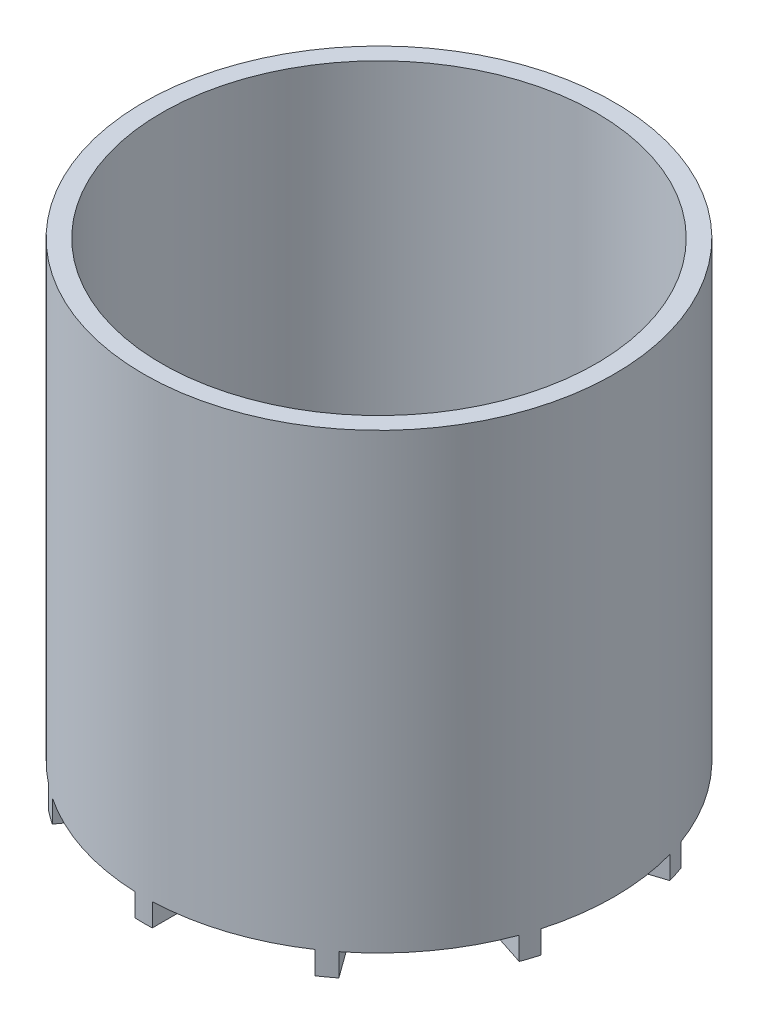
ISO-10303-21;
HEADER;
FILE_DESCRIPTION(('STEP AP214'),'2;1');
FILE_NAME('part.step','',(''),(''),'','','');
FILE_SCHEMA(('AUTOMOTIVE_DESIGN { 1 0 10303 214 1 1 1 1 }'));
ENDSEC;
DATA;
#1=APPLICATION_CONTEXT('core data for automotive mechanical design processes');
#2=APPLICATION_PROTOCOL_DEFINITION('international standard','automotive_design',2000,#1);
#3=PRODUCT_CONTEXT('',#1,'mechanical');
#4=PRODUCT('Part','Part','',(#3));
#5=PRODUCT_RELATED_PRODUCT_CATEGORY('part','',(#4));
#6=PRODUCT_DEFINITION_FORMATION('','',#4);
#7=PRODUCT_DEFINITION_CONTEXT('part definition',#1,'design');
#8=PRODUCT_DEFINITION('design','',#6,#7);
#9=PRODUCT_DEFINITION_SHAPE('','',#8);
#10=(LENGTH_UNIT() NAMED_UNIT(*) SI_UNIT(.MILLI.,.METRE.));
#11=(NAMED_UNIT(*) PLANE_ANGLE_UNIT() SI_UNIT($,.RADIAN.));
#12=(NAMED_UNIT(*) SI_UNIT($,.STERADIAN.) SOLID_ANGLE_UNIT());
#13=UNCERTAINTY_MEASURE_WITH_UNIT(LENGTH_MEASURE(1.E-05),#10,'distance_accuracy_value','');
#14=(GEOMETRIC_REPRESENTATION_CONTEXT(3) GLOBAL_UNCERTAINTY_ASSIGNED_CONTEXT((#13)) GLOBAL_UNIT_ASSIGNED_CONTEXT((#10,
#11,#12)) REPRESENTATION_CONTEXT('',''));
#15=CARTESIAN_POINT('',(0.,0.,0.));
#16=DIRECTION('',(0.,0.,1.));
#17=DIRECTION('',(1.,0.,0.));
#18=AXIS2_PLACEMENT_3D('',#15,#16,#17);
#19=CARTESIAN_POINT('',(0.,-7.175,0.));
#20=DIRECTION('',(0.,-1.,0.));
#21=DIRECTION('',(0.,0.,-1.));
#22=AXIS2_PLACEMENT_3D('',#19,#20,#21);
#23=PLANE('',#22);
#24=DIRECTION('',(-0.587785252292469,0.,0.809016994374951));
#25=VECTOR('',#24,1.);
#26=CARTESIAN_POINT('',(23.0473107968092,-7.175,-34.2738543212648));
#27=LINE('',#26,#25);
#28=CARTESIAN_POINT('',(23.031284706289,-7.175,-34.251796300017));
#29=VERTEX_POINT('',#28);
#30=CARTESIAN_POINT('',(1.50000000000001,-7.175,-4.61652530576295));
#31=VERTEX_POINT('',#30);
#32=EDGE_CURVE('E555',#29,#31,#27,.T.);
#33=ORIENTED_EDGE('',*,*,#32,.F.);
#34=CARTESIAN_POINT('',(0.,-7.175,0.));
#35=DIRECTION('',(0.,-1.,0.));
#36=DIRECTION('',(0.,0.,-1.));
#37=AXIS2_PLACEMENT_3D('',#34,#35,#36);
#38=CIRCLE('',#37,41.275);
#39=CARTESIAN_POINT('',(25.4583356894139,-7.175,-32.4884405431396));
#40=VERTEX_POINT('',#39);
#41=EDGE_CURVE('E479',#29,#40,#38,.T.);
#42=ORIENTED_EDGE('',*,*,#41,.T.);
#43=DIRECTION('',(-0.587785252292469,0.,0.809016994374951));
#44=VECTOR('',#43,1.);
#45=CARTESIAN_POINT('',(25.4743617799341,-7.175,-32.5104985643874));
#46=LINE('',#45,#44);
#47=CARTESIAN_POINT('',(3.92705098312483,-7.175,-2.85316954888548));
#48=VERTEX_POINT('',#47);
#49=EDGE_CURVE('E550',#40,#48,#46,.T.);
#50=ORIENTED_EDGE('',*,*,#49,.T.);
#51=DIRECTION('',(-0.951056516295152,0.,0.309016994374952));
#52=VECTOR('',#51,1.);
#53=CARTESIAN_POINT('',(38.79133221852,-7.175,-14.1812612172689));
#54=LINE('',#53,#52);
#55=CARTESIAN_POINT('',(38.7654014593516,-7.175,-14.1728358028768));
#56=VERTEX_POINT('',#55);
#57=EDGE_CURVE('E540',#56,#48,#54,.T.);
#58=ORIENTED_EDGE('',*,*,#57,.F.);
#59=CARTESIAN_POINT('',(39.6924524424764,-7.175,-11.3196662539913));
#60=VERTEX_POINT('',#59);
#61=EDGE_CURVE('E685',#56,#60,#38,.T.);
#62=ORIENTED_EDGE('',*,*,#61,.T.);
#63=DIRECTION('',(-0.951056516295152,0.,0.309016994374952));
#64=VECTOR('',#63,1.);
#65=CARTESIAN_POINT('',(39.7183832016448,-7.175,-11.3280916683834));
#66=LINE('',#65,#64);
#67=CARTESIAN_POINT('',(4.85410196624966,-7.175,0.));
#68=VERTEX_POINT('',#67);
#69=EDGE_CURVE('E535',#60,#68,#66,.T.);
#70=ORIENTED_EDGE('',*,*,#69,.T.);
#71=DIRECTION('',(-0.951056516295154,0.,-0.309016994374945));
#72=VECTOR('',#71,1.);
#73=CARTESIAN_POINT('',(39.7183832016449,-7.175,11.3280916683831));
#74=LINE('',#73,#72);
#75=CARTESIAN_POINT('',(39.6924524424765,-7.175,11.319666253991));
#76=VERTEX_POINT('',#75);
#77=EDGE_CURVE('E525',#76,#68,#74,.T.);
#78=ORIENTED_EDGE('',*,*,#77,.F.);
#79=CARTESIAN_POINT('',(38.7654014593517,-7.175,14.1728358028765));
#80=VERTEX_POINT('',#79);
#81=EDGE_CURVE('E686',#76,#80,#38,.T.);
#82=ORIENTED_EDGE('',*,*,#81,.T.);
#83=DIRECTION('',(-0.951056516295154,0.,-0.309016994374945));
#84=VECTOR('',#83,1.);
#85=CARTESIAN_POINT('',(38.7913322185201,-7.175,14.1812612172686));
#86=LINE('',#85,#84);
#87=CARTESIAN_POINT('',(3.92705098312483,-7.175,2.85316954888544));
#88=VERTEX_POINT('',#87);
#89=EDGE_CURVE('E521',#80,#88,#86,.T.);
#90=ORIENTED_EDGE('',*,*,#89,.T.);
#91=DIRECTION('',(-0.587785252292474,0.,-0.809016994374947));
#92=VECTOR('',#91,1.);
#93=CARTESIAN_POINT('',(25.4743617799343,-7.175,32.5104985643872));
#94=LINE('',#93,#92);
#95=CARTESIAN_POINT('',(25.4583356894141,-7.175,32.4884405431394));
#96=VERTEX_POINT('',#95);
#97=EDGE_CURVE('E510',#96,#88,#94,.T.);
#98=ORIENTED_EDGE('',*,*,#97,.F.);
#99=CARTESIAN_POINT('',(23.0312847062893,-7.175,34.2517963000168));
#100=VERTEX_POINT('',#99);
#101=EDGE_CURVE('E688',#96,#100,#38,.T.);
#102=ORIENTED_EDGE('',*,*,#101,.T.);
#103=DIRECTION('',(-0.587785252292474,0.,-0.809016994374947));
#104=VECTOR('',#103,1.);
#105=CARTESIAN_POINT('',(23.0473107968095,-7.175,34.2738543212647));
#106=LINE('',#105,#104);
#107=CARTESIAN_POINT('',(1.5,-7.175,4.61652530576288));
#108=VERTEX_POINT('',#107);
#109=EDGE_CURVE('E505',#100,#108,#106,.T.);
#110=ORIENTED_EDGE('',*,*,#109,.T.);
#111=DIRECTION('',(0.,0.,-1.));
#112=VECTOR('',#111,1.);
#113=CARTESIAN_POINT('',(1.5,-7.175,41.275));
#114=LINE('',#113,#112);
#115=CARTESIAN_POINT('',(1.5,-7.175,41.2477347862886));
#116=VERTEX_POINT('',#115);
#117=EDGE_CURVE('E491',#116,#108,#114,.T.);
#118=ORIENTED_EDGE('',*,*,#117,.F.);
#119=CARTESIAN_POINT('',(-1.5,-7.175,41.2477347862886));
#120=VERTEX_POINT('',#119);
#121=EDGE_CURVE('E690',#116,#120,#38,.T.);
#122=ORIENTED_EDGE('',*,*,#121,.T.);
#123=DIRECTION('',(0.,0.,-1.));
#124=VECTOR('',#123,1.);
#125=CARTESIAN_POINT('',(-1.5,-7.175,41.275));
#126=LINE('',#125,#124);
#127=CARTESIAN_POINT('',(-1.49999999999999,-7.175,4.6165253057629));
#128=VERTEX_POINT('',#127);
#129=EDGE_CURVE('E492',#120,#128,#126,.T.);
#130=ORIENTED_EDGE('',*,*,#129,.T.);
#131=CARTESIAN_POINT('',(-23.031284706289,-7.175,34.251796300017));
#132=VERTEX_POINT('',#131);
#133=EDGE_CURVE('E554',#128,#132,#46,.T.);
#134=ORIENTED_EDGE('',*,*,#133,.T.);
#135=CARTESIAN_POINT('',(-25.4583356894139,-7.175,32.4884405431396));
#136=VERTEX_POINT('',#135);
#137=EDGE_CURVE('E295',#132,#136,#38,.T.);
#138=ORIENTED_EDGE('',*,*,#137,.T.);
#139=CARTESIAN_POINT('',(-3.9270509831248,-7.175,2.85316954888546));
#140=VERTEX_POINT('',#139);
#141=EDGE_CURVE('E553',#140,#136,#27,.T.);
#142=ORIENTED_EDGE('',*,*,#141,.F.);
#143=CARTESIAN_POINT('',(-38.7654014593515,-7.175,14.1728358028768));
#144=VERTEX_POINT('',#143);
#145=EDGE_CURVE('E539',#140,#144,#66,.T.);
#146=ORIENTED_EDGE('',*,*,#145,.T.);
#147=CARTESIAN_POINT('',(-39.6924524424764,-7.175,11.3196662539913));
#148=VERTEX_POINT('',#147);
#149=EDGE_CURVE('E288',#144,#148,#38,.T.);
#150=ORIENTED_EDGE('',*,*,#149,.T.);
#151=CARTESIAN_POINT('',(-4.85410196624969,-7.175,0.));
#152=VERTEX_POINT('',#151);
#153=EDGE_CURVE('E538',#152,#148,#54,.T.);
#154=ORIENTED_EDGE('',*,*,#153,.F.);
#155=CARTESIAN_POINT('',(-39.6924524424765,-7.175,-11.319666253991));
#156=VERTEX_POINT('',#155);
#157=EDGE_CURVE('E524',#152,#156,#86,.T.);
#158=ORIENTED_EDGE('',*,*,#157,.T.);
#159=CARTESIAN_POINT('',(-38.7654014593517,-7.175,-14.1728358028765));
#160=VERTEX_POINT('',#159);
#161=EDGE_CURVE('E693',#156,#160,#38,.T.);
#162=ORIENTED_EDGE('',*,*,#161,.T.);
#163=CARTESIAN_POINT('',(-3.92705098312484,-7.175,-2.85316954888544));
#164=VERTEX_POINT('',#163);
#165=EDGE_CURVE('E523',#164,#160,#74,.T.);
#166=ORIENTED_EDGE('',*,*,#165,.F.);
#167=CARTESIAN_POINT('',(-25.4583356894141,-7.175,-32.4884405431394));
#168=VERTEX_POINT('',#167);
#169=EDGE_CURVE('E509',#164,#168,#106,.T.);
#170=ORIENTED_EDGE('',*,*,#169,.T.);
#171=CARTESIAN_POINT('',(-23.0312847062893,-7.175,-34.2517963000168));
#172=VERTEX_POINT('',#171);
#173=EDGE_CURVE('E477',#168,#172,#38,.T.);
#174=ORIENTED_EDGE('',*,*,#173,.T.);
#175=CARTESIAN_POINT('',(-1.5,-7.175,-4.61652530576286));
#176=VERTEX_POINT('',#175);
#177=EDGE_CURVE('E508',#176,#172,#94,.T.);
#178=ORIENTED_EDGE('',*,*,#177,.F.);
#179=CARTESIAN_POINT('',(-1.5,-7.175,-41.2477347862886));
#180=VERTEX_POINT('',#179);
#181=EDGE_CURVE('E475',#176,#180,#126,.T.);
#182=ORIENTED_EDGE('',*,*,#181,.T.);
#183=CARTESIAN_POINT('',(1.5,-7.175,-41.2477347862886));
#184=VERTEX_POINT('',#183);
#185=EDGE_CURVE('E468',#180,#184,#38,.T.);
#186=ORIENTED_EDGE('',*,*,#185,.T.);
#187=EDGE_CURVE('E472',#31,#184,#114,.T.);
#188=ORIENTED_EDGE('',*,*,#187,.F.);
#189=EDGE_LOOP('',(#33,#42,#50,#58,#62,#70,#78,#82,#90,#98,#102,#110,#118,#122,#130,#134,#138,
#142,#146,#150,#154,#158,#162,#166,#170,#174,#178,#182,#186,#188));
#190=FACE_BOUND('',#189,.T.);
#191=ADVANCED_FACE('F273',(#190),#23,.T.);
#192=CARTESIAN_POINT('',(-1.5,-7.175,41.275));
#193=DIRECTION('',(1.,0.,0.));
#194=DIRECTION('',(0.,0.,-1.));
#195=AXIS2_PLACEMENT_3D('',#192,#193,#194);
#196=PLANE('',#195);
#197=DIRECTION('',(0.,-1.,0.));
#198=VECTOR('',#197,1.);
#199=CARTESIAN_POINT('',(-1.5,76.2,41.2477347862886));
#200=LINE('',#199,#198);
#201=CARTESIAN_POINT('',(-1.5,-3.175,41.2477347862886));
#202=VERTEX_POINT('',#201);
#203=EDGE_CURVE('E642',#202,#120,#200,.T.);
#204=ORIENTED_EDGE('',*,*,#203,.F.);
#205=DIRECTION('',(0.,0.,-1.));
#206=VECTOR('',#205,1.);
#207=CARTESIAN_POINT('',(-1.5,-3.175,41.275));
#208=LINE('',#207,#206);
#209=CARTESIAN_POINT('',(-1.49999999999999,-3.175,4.6165253057629));
#210=VERTEX_POINT('',#209);
#211=EDGE_CURVE('E281',#202,#210,#208,.T.);
#212=ORIENTED_EDGE('',*,*,#211,.T.);
#213=DIRECTION('',(0.,1.,0.));
#214=VECTOR('',#213,1.);
#215=CARTESIAN_POINT('',(-1.5,-7.175,4.61652530576292));
#216=LINE('',#215,#214);
#217=EDGE_CURVE('E576',#128,#210,#216,.T.);
#218=ORIENTED_EDGE('',*,*,#217,.F.);
#219=ORIENTED_EDGE('',*,*,#129,.F.);
#220=EDGE_LOOP('',(#204,#212,#218,#219));
#221=FACE_BOUND('',#220,.T.);
#222=ADVANCED_FACE('F756',(#221),#196,.F.);
#223=CARTESIAN_POINT('',(1.5,-7.175,41.275));
#224=DIRECTION('',(1.,0.,0.));
#225=DIRECTION('',(0.,0.,-1.));
#226=AXIS2_PLACEMENT_3D('',#223,#224,#225);
#227=PLANE('',#226);
#228=DIRECTION('',(0.,0.,-1.));
#229=VECTOR('',#228,1.);
#230=CARTESIAN_POINT('',(1.5,-3.175,41.275));
#231=LINE('',#230,#229);
#232=CARTESIAN_POINT('',(1.5,-3.175,41.2477347862886));
#233=VERTEX_POINT('',#232);
#234=CARTESIAN_POINT('',(1.5,-3.175,4.61652530576288));
#235=VERTEX_POINT('',#234);
#236=EDGE_CURVE('E499',#233,#235,#231,.T.);
#237=ORIENTED_EDGE('',*,*,#236,.F.);
#238=DIRECTION('',(0.,-1.,0.));
#239=VECTOR('',#238,1.);
#240=CARTESIAN_POINT('',(1.5,76.2,41.2477347862886));
#241=LINE('',#240,#239);
#242=EDGE_CURVE('E637',#233,#116,#241,.T.);
#243=ORIENTED_EDGE('',*,*,#242,.T.);
#244=ORIENTED_EDGE('',*,*,#117,.T.);
#245=DIRECTION('',(0.,1.,0.));
#246=VECTOR('',#245,1.);
#247=CARTESIAN_POINT('',(1.5,-7.175,4.61652530576288));
#248=LINE('',#247,#246);
#249=EDGE_CURVE('E494',#108,#235,#248,.T.);
#250=ORIENTED_EDGE('',*,*,#249,.T.);
#251=EDGE_LOOP('',(#237,#243,#244,#250));
#252=FACE_BOUND('',#251,.T.);
#253=ADVANCED_FACE('F742',(#252),#227,.T.);
#254=CARTESIAN_POINT('',(38.7913322185201,-7.175,14.1812612172686));
#255=DIRECTION('',(0.309016994374945,0.,-0.951056516295154));
#256=DIRECTION('',(-0.951056516295155,0.,-0.309016994374945));
#257=AXIS2_PLACEMENT_3D('',#254,#255,#256);
#258=PLANE('',#257);
#259=DIRECTION('',(0.,-1.,0.));
#260=VECTOR('',#259,1.);
#261=CARTESIAN_POINT('',(-39.6924524424765,76.2,-11.319666253991));
#262=LINE('',#261,#260);
#263=CARTESIAN_POINT('',(-39.6924524424765,-3.175,-11.319666253991));
#264=VERTEX_POINT('',#263);
#265=EDGE_CURVE('E647',#156,#264,#262,.F.);
#266=ORIENTED_EDGE('',*,*,#265,.F.);
#267=ORIENTED_EDGE('',*,*,#157,.F.);
#268=DIRECTION('',(0.,1.,0.));
#269=VECTOR('',#268,1.);
#270=CARTESIAN_POINT('',(-4.85410196624968,-7.175,0.));
#271=LINE('',#270,#269);
#272=CARTESIAN_POINT('',(-4.85410196624969,-3.175,0.));
#273=VERTEX_POINT('',#272);
#274=EDGE_CURVE('E570',#152,#273,#271,.T.);
#275=ORIENTED_EDGE('',*,*,#274,.T.);
#276=DIRECTION('',(-0.951056516295154,0.,-0.309016994374945));
#277=VECTOR('',#276,1.);
#278=CARTESIAN_POINT('',(38.7913322185201,-3.175,14.1812612172686));
#279=LINE('',#278,#277);
#280=EDGE_CURVE('E530',#273,#264,#279,.T.);
#281=ORIENTED_EDGE('',*,*,#280,.T.);
#282=EDGE_LOOP('',(#266,#267,#275,#281));
#283=FACE_BOUND('',#282,.T.);
#284=ADVANCED_FACE('F766',(#283),#258,.F.);
#285=CARTESIAN_POINT('',(39.7183832016449,-7.175,11.3280916683831));
#286=DIRECTION('',(0.309016994374945,0.,-0.951056516295154));
#287=DIRECTION('',(-0.951056516295155,0.,-0.309016994374945));
#288=AXIS2_PLACEMENT_3D('',#285,#286,#287);
#289=PLANE('',#288);
#290=ORIENTED_EDGE('',*,*,#165,.T.);
#291=DIRECTION('',(0.,-1.,0.));
#292=VECTOR('',#291,1.);
#293=CARTESIAN_POINT('',(-38.7654014593516,76.2,-14.1728358028765));
#294=LINE('',#293,#292);
#295=CARTESIAN_POINT('',(-38.7654014593516,-3.175,-14.1728358028765));
#296=VERTEX_POINT('',#295);
#297=EDGE_CURVE('E651',#160,#296,#294,.F.);
#298=ORIENTED_EDGE('',*,*,#297,.T.);
#299=DIRECTION('',(-0.951056516295154,0.,-0.309016994374945));
#300=VECTOR('',#299,1.);
#301=CARTESIAN_POINT('',(39.7183832016449,-3.175,11.3280916683831));
#302=LINE('',#301,#300);
#303=CARTESIAN_POINT('',(-3.92705098312484,-3.175,-2.85316954888544));
#304=VERTEX_POINT('',#303);
#305=EDGE_CURVE('E534',#304,#296,#302,.T.);
#306=ORIENTED_EDGE('',*,*,#305,.F.);
#307=DIRECTION('',(0.,1.,0.));
#308=VECTOR('',#307,1.);
#309=CARTESIAN_POINT('',(-3.92705098312484,-7.175,-2.85316954888545));
#310=LINE('',#309,#308);
#311=EDGE_CURVE('E574',#164,#304,#310,.T.);
#312=ORIENTED_EDGE('',*,*,#311,.F.);
#313=EDGE_LOOP('',(#290,#298,#306,#312));
#314=FACE_BOUND('',#313,.T.);
#315=ADVANCED_FACE('F776',(#314),#289,.T.);
#316=CARTESIAN_POINT('',(38.79133221852,-7.175,-14.1812612172689));
#317=DIRECTION('',(-0.309016994374952,0.,-0.951056516295152));
#318=DIRECTION('',(-0.951056516295152,0.,0.309016994374952));
#319=AXIS2_PLACEMENT_3D('',#316,#317,#318);
#320=PLANE('',#319);
#321=ORIENTED_EDGE('',*,*,#153,.T.);
#322=DIRECTION('',(0.,-1.,0.));
#323=VECTOR('',#322,1.);
#324=CARTESIAN_POINT('',(-39.6924524424764,76.2,11.3196662539913));
#325=LINE('',#324,#323);
#326=CARTESIAN_POINT('',(-39.6924524424764,-3.175,11.3196662539913));
#327=VERTEX_POINT('',#326);
#328=EDGE_CURVE('E653',#148,#327,#325,.F.);
#329=ORIENTED_EDGE('',*,*,#328,.T.);
#330=DIRECTION('',(-0.951056516295152,0.,0.309016994374952));
#331=VECTOR('',#330,1.);
#332=CARTESIAN_POINT('',(38.79133221852,-3.175,-14.1812612172689));
#333=LINE('',#332,#331);
#334=EDGE_CURVE('E549',#273,#327,#333,.T.);
#335=ORIENTED_EDGE('',*,*,#334,.F.);
#336=ORIENTED_EDGE('',*,*,#274,.F.);
#337=EDGE_LOOP('',(#321,#329,#335,#336));
#338=FACE_BOUND('',#337,.T.);
#339=ADVANCED_FACE('F779',(#338),#320,.T.);
#340=CARTESIAN_POINT('',(39.7183832016448,-7.175,-11.3280916683834));
#341=DIRECTION('',(-0.309016994374952,0.,-0.951056516295152));
#342=DIRECTION('',(-0.951056516295152,0.,0.309016994374952));
#343=AXIS2_PLACEMENT_3D('',#340,#341,#342);
#344=PLANE('',#343);
#345=DIRECTION('',(0.,-1.,0.));
#346=VECTOR('',#345,1.);
#347=CARTESIAN_POINT('',(-38.7654014593515,76.2,14.1728358028768));
#348=LINE('',#347,#346);
#349=CARTESIAN_POINT('',(-38.7654014593515,-3.175,14.1728358028768));
#350=VERTEX_POINT('',#349);
#351=EDGE_CURVE('E627',#144,#350,#348,.F.);
#352=ORIENTED_EDGE('',*,*,#351,.F.);
#353=ORIENTED_EDGE('',*,*,#145,.F.);
#354=DIRECTION('',(0.,1.,0.));
#355=VECTOR('',#354,1.);
#356=CARTESIAN_POINT('',(-3.92705098312482,-7.175,2.85316954888547));
#357=LINE('',#356,#355);
#358=CARTESIAN_POINT('',(-3.9270509831248,-3.175,2.85316954888546));
#359=VERTEX_POINT('',#358);
#360=EDGE_CURVE('E564',#140,#359,#357,.T.);
#361=ORIENTED_EDGE('',*,*,#360,.T.);
#362=DIRECTION('',(-0.951056516295152,0.,0.309016994374952));
#363=VECTOR('',#362,1.);
#364=CARTESIAN_POINT('',(39.7183832016448,-3.175,-11.3280916683834));
#365=LINE('',#364,#363);
#366=EDGE_CURVE('E545',#359,#350,#365,.T.);
#367=ORIENTED_EDGE('',*,*,#366,.T.);
#368=EDGE_LOOP('',(#352,#353,#361,#367));
#369=FACE_BOUND('',#368,.T.);
#370=ADVANCED_FACE('F774',(#369),#344,.F.);
#371=CARTESIAN_POINT('',(23.0473107968095,-7.175,34.2738543212647));
#372=DIRECTION('',(0.809016994374947,0.,-0.587785252292474));
#373=DIRECTION('',(-0.587785252292474,0.,-0.809016994374947));
#374=AXIS2_PLACEMENT_3D('',#371,#372,#373);
#375=PLANE('',#374);
#376=DIRECTION('',(0.,-1.,0.));
#377=VECTOR('',#376,1.);
#378=CARTESIAN_POINT('',(-25.4583356894141,76.2,-32.4884405431394));
#379=LINE('',#378,#377);
#380=CARTESIAN_POINT('',(-25.4583356894141,-3.175,-32.4884405431394));
#381=VERTEX_POINT('',#380);
#382=EDGE_CURVE('E655',#168,#381,#379,.F.);
#383=ORIENTED_EDGE('',*,*,#382,.F.);
#384=ORIENTED_EDGE('',*,*,#169,.F.);
#385=ORIENTED_EDGE('',*,*,#311,.T.);
#386=DIRECTION('',(-0.587785252292474,0.,-0.809016994374947));
#387=VECTOR('',#386,1.);
#388=CARTESIAN_POINT('',(23.0473107968095,-3.175,34.2738543212647));
#389=LINE('',#388,#387);
#390=EDGE_CURVE('E516',#304,#381,#389,.T.);
#391=ORIENTED_EDGE('',*,*,#390,.T.);
#392=EDGE_LOOP('',(#383,#384,#385,#391));
#393=FACE_BOUND('',#392,.T.);
#394=ADVANCED_FACE('F771',(#393),#375,.F.);
#395=CARTESIAN_POINT('',(25.4743617799343,-7.175,32.5104985643872));
#396=DIRECTION('',(0.809016994374947,0.,-0.587785252292474));
#397=DIRECTION('',(-0.587785252292474,0.,-0.809016994374947));
#398=AXIS2_PLACEMENT_3D('',#395,#396,#397);
#399=PLANE('',#398);
#400=ORIENTED_EDGE('',*,*,#177,.T.);
#401=DIRECTION('',(0.,-1.,0.));
#402=VECTOR('',#401,1.);
#403=CARTESIAN_POINT('',(-23.0312847062893,76.2,-34.2517963000168));
#404=LINE('',#403,#402);
#405=CARTESIAN_POINT('',(-23.0312847062893,-3.175,-34.2517963000168));
#406=VERTEX_POINT('',#405);
#407=EDGE_CURVE('E657',#172,#406,#404,.F.);
#408=ORIENTED_EDGE('',*,*,#407,.T.);
#409=DIRECTION('',(-0.587785252292474,0.,-0.809016994374947));
#410=VECTOR('',#409,1.);
#411=CARTESIAN_POINT('',(25.4743617799343,-3.175,32.5104985643872));
#412=LINE('',#411,#410);
#413=CARTESIAN_POINT('',(-1.5,-3.175,-4.61652530576286));
#414=VERTEX_POINT('',#413);
#415=EDGE_CURVE('E520',#414,#406,#412,.T.);
#416=ORIENTED_EDGE('',*,*,#415,.F.);
#417=DIRECTION('',(0.,1.,0.));
#418=VECTOR('',#417,1.);
#419=CARTESIAN_POINT('',(-1.5,-7.175,-4.61652530576286));
#420=LINE('',#419,#418);
#421=EDGE_CURVE('E579',#176,#414,#420,.T.);
#422=ORIENTED_EDGE('',*,*,#421,.F.);
#423=EDGE_LOOP('',(#400,#408,#416,#422));
#424=FACE_BOUND('',#423,.T.);
#425=ADVANCED_FACE('F705',(#424),#399,.T.);
#426=CARTESIAN_POINT('',(23.0473107968092,-7.175,-34.2738543212648));
#427=DIRECTION('',(-0.809016994374951,0.,-0.587785252292469));
#428=DIRECTION('',(-0.587785252292469,0.,0.809016994374951));
#429=AXIS2_PLACEMENT_3D('',#426,#427,#428);
#430=PLANE('',#429);
#431=ORIENTED_EDGE('',*,*,#141,.T.);
#432=DIRECTION('',(0.,-1.,0.));
#433=VECTOR('',#432,1.);
#434=CARTESIAN_POINT('',(-25.4583356894139,76.2,32.4884405431396));
#435=LINE('',#434,#433);
#436=CARTESIAN_POINT('',(-25.4583356894139,-3.175,32.4884405431396));
#437=VERTEX_POINT('',#436);
#438=EDGE_CURVE('E625',#136,#437,#435,.F.);
#439=ORIENTED_EDGE('',*,*,#438,.T.);
#440=DIRECTION('',(-0.587785252292469,0.,0.809016994374951));
#441=VECTOR('',#440,1.);
#442=CARTESIAN_POINT('',(23.0473107968092,-3.175,-34.2738543212648));
#443=LINE('',#442,#441);
#444=EDGE_CURVE('E563',#359,#437,#443,.T.);
#445=ORIENTED_EDGE('',*,*,#444,.F.);
#446=ORIENTED_EDGE('',*,*,#360,.F.);
#447=EDGE_LOOP('',(#431,#439,#445,#446));
#448=FACE_BOUND('',#447,.T.);
#449=ADVANCED_FACE('F770',(#448),#430,.T.);
#450=CARTESIAN_POINT('',(25.4743617799341,-7.175,-32.5104985643874));
#451=DIRECTION('',(-0.809016994374951,0.,-0.587785252292469));
#452=DIRECTION('',(-0.587785252292469,0.,0.809016994374951));
#453=AXIS2_PLACEMENT_3D('',#450,#451,#452);
#454=PLANE('',#453);
#455=DIRECTION('',(0.,-1.,0.));
#456=VECTOR('',#455,1.);
#457=CARTESIAN_POINT('',(-23.031284706289,76.2,34.251796300017));
#458=LINE('',#457,#456);
#459=CARTESIAN_POINT('',(-23.031284706289,-3.175,34.251796300017));
#460=VERTEX_POINT('',#459);
#461=EDGE_CURVE('E661',#132,#460,#458,.F.);
#462=ORIENTED_EDGE('',*,*,#461,.F.);
#463=ORIENTED_EDGE('',*,*,#133,.F.);
#464=ORIENTED_EDGE('',*,*,#217,.T.);
#465=DIRECTION('',(-0.587785252292469,0.,0.809016994374951));
#466=VECTOR('',#465,1.);
#467=CARTESIAN_POINT('',(25.4743617799341,-3.175,-32.5104985643874));
#468=LINE('',#467,#466);
#469=EDGE_CURVE('E559',#210,#460,#468,.T.);
#470=ORIENTED_EDGE('',*,*,#469,.T.);
#471=EDGE_LOOP('',(#462,#463,#464,#470));
#472=FACE_BOUND('',#471,.T.);
#473=ADVANCED_FACE('F792',(#472),#454,.F.);
#474=CARTESIAN_POINT('',(39.6924524424765,-3.175,11.319666253991));
#475=VERTEX_POINT('',#474);
#476=CARTESIAN_POINT('',(4.85410196624966,-3.175,0.));
#477=VERTEX_POINT('',#476);
#478=EDGE_CURVE('E529',#475,#477,#302,.T.);
#479=ORIENTED_EDGE('',*,*,#478,.F.);
#480=DIRECTION('',(0.,-1.,0.));
#481=VECTOR('',#480,1.);
#482=CARTESIAN_POINT('',(39.6924524424765,76.2,11.319666253991));
#483=LINE('',#482,#481);
#484=EDGE_CURVE('E665',#475,#76,#483,.T.);
#485=ORIENTED_EDGE('',*,*,#484,.T.);
#486=ORIENTED_EDGE('',*,*,#77,.T.);
#487=DIRECTION('',(0.,1.,0.));
#488=VECTOR('',#487,1.);
#489=CARTESIAN_POINT('',(4.85410196624966,-7.175,0.));
#490=LINE('',#489,#488);
#491=EDGE_CURVE('E527',#68,#477,#490,.T.);
#492=ORIENTED_EDGE('',*,*,#491,.T.);
#493=EDGE_LOOP('',(#479,#485,#486,#492));
#494=FACE_BOUND('',#493,.T.);
#495=ADVANCED_FACE('F728',(#494),#289,.T.);
#496=DIRECTION('',(0.,-1.,0.));
#497=VECTOR('',#496,1.);
#498=CARTESIAN_POINT('',(39.6924524424764,76.2,-11.3196662539913));
#499=LINE('',#498,#497);
#500=CARTESIAN_POINT('',(39.6924524424764,-3.175,-11.3196662539913));
#501=VERTEX_POINT('',#500);
#502=EDGE_CURVE('E663',#501,#60,#499,.T.);
#503=ORIENTED_EDGE('',*,*,#502,.F.);
#504=EDGE_CURVE('E533',#501,#477,#365,.T.);
#505=ORIENTED_EDGE('',*,*,#504,.T.);
#506=ORIENTED_EDGE('',*,*,#491,.F.);
#507=ORIENTED_EDGE('',*,*,#69,.F.);
#508=EDGE_LOOP('',(#503,#505,#506,#507));
#509=FACE_BOUND('',#508,.T.);
#510=ADVANCED_FACE('F725',(#509),#344,.F.);
#511=CARTESIAN_POINT('',(38.7654014593515,-3.175,-14.1728358028768));
#512=VERTEX_POINT('',#511);
#513=CARTESIAN_POINT('',(3.92705098312483,-3.175,-2.85316954888548));
#514=VERTEX_POINT('',#513);
#515=EDGE_CURVE('E544',#512,#514,#333,.T.);
#516=ORIENTED_EDGE('',*,*,#515,.F.);
#517=DIRECTION('',(0.,-1.,0.));
#518=VECTOR('',#517,1.);
#519=CARTESIAN_POINT('',(38.7654014593515,76.2,-14.1728358028768));
#520=LINE('',#519,#518);
#521=EDGE_CURVE('E668',#512,#56,#520,.T.);
#522=ORIENTED_EDGE('',*,*,#521,.T.);
#523=ORIENTED_EDGE('',*,*,#57,.T.);
#524=DIRECTION('',(0.,1.,0.));
#525=VECTOR('',#524,1.);
#526=CARTESIAN_POINT('',(3.92705098312483,-7.175,-2.85316954888548));
#527=LINE('',#526,#525);
#528=EDGE_CURVE('E542',#48,#514,#527,.T.);
#529=ORIENTED_EDGE('',*,*,#528,.T.);
#530=EDGE_LOOP('',(#516,#522,#523,#529));
#531=FACE_BOUND('',#530,.T.);
#532=ADVANCED_FACE('F720',(#531),#320,.T.);
#533=DIRECTION('',(0.,-1.,0.));
#534=VECTOR('',#533,1.);
#535=CARTESIAN_POINT('',(38.7654014593516,76.2,14.1728358028765));
#536=LINE('',#535,#534);
#537=CARTESIAN_POINT('',(38.7654014593516,-3.175,14.1728358028765));
#538=VERTEX_POINT('',#537);
#539=EDGE_CURVE('E671',#538,#80,#536,.T.);
#540=ORIENTED_EDGE('',*,*,#539,.F.);
#541=CARTESIAN_POINT('',(3.92705098312483,-3.175,2.85316954888544));
#542=VERTEX_POINT('',#541);
#543=EDGE_CURVE('E519',#538,#542,#279,.T.);
#544=ORIENTED_EDGE('',*,*,#543,.T.);
#545=DIRECTION('',(0.,1.,0.));
#546=VECTOR('',#545,1.);
#547=CARTESIAN_POINT('',(3.92705098312483,-7.175,2.85316954888544));
#548=LINE('',#547,#546);
#549=EDGE_CURVE('E513',#88,#542,#548,.T.);
#550=ORIENTED_EDGE('',*,*,#549,.F.);
#551=ORIENTED_EDGE('',*,*,#89,.F.);
#552=EDGE_LOOP('',(#540,#544,#550,#551));
#553=FACE_BOUND('',#552,.T.);
#554=ADVANCED_FACE('F733',(#553),#258,.F.);
#555=CARTESIAN_POINT('',(23.031284706289,-3.175,-34.251796300017));
#556=VERTEX_POINT('',#555);
#557=CARTESIAN_POINT('',(1.50000000000001,-3.175,-4.61652530576295));
#558=VERTEX_POINT('',#557);
#559=EDGE_CURVE('E558',#556,#558,#443,.T.);
#560=ORIENTED_EDGE('',*,*,#559,.F.);
#561=DIRECTION('',(0.,-1.,0.));
#562=VECTOR('',#561,1.);
#563=CARTESIAN_POINT('',(23.031284706289,76.2,-34.251796300017));
#564=LINE('',#563,#562);
#565=EDGE_CURVE('E673',#556,#29,#564,.T.);
#566=ORIENTED_EDGE('',*,*,#565,.T.);
#567=ORIENTED_EDGE('',*,*,#32,.T.);
#568=DIRECTION('',(0.,1.,0.));
#569=VECTOR('',#568,1.);
#570=CARTESIAN_POINT('',(1.5,-7.175,-4.61652530576293));
#571=LINE('',#570,#569);
#572=EDGE_CURVE('E490',#31,#558,#571,.T.);
#573=ORIENTED_EDGE('',*,*,#572,.T.);
#574=EDGE_LOOP('',(#560,#566,#567,#573));
#575=FACE_BOUND('',#574,.T.);
#576=ADVANCED_FACE('F712',(#575),#430,.T.);
#577=DIRECTION('',(0.,-1.,0.));
#578=VECTOR('',#577,1.);
#579=CARTESIAN_POINT('',(25.4583356894139,76.2,-32.4884405431396));
#580=LINE('',#579,#578);
#581=CARTESIAN_POINT('',(25.4583356894139,-3.175,-32.4884405431396));
#582=VERTEX_POINT('',#581);
#583=EDGE_CURVE('E676',#582,#40,#580,.T.);
#584=ORIENTED_EDGE('',*,*,#583,.F.);
#585=EDGE_CURVE('E548',#582,#514,#468,.T.);
#586=ORIENTED_EDGE('',*,*,#585,.T.);
#587=ORIENTED_EDGE('',*,*,#528,.F.);
#588=ORIENTED_EDGE('',*,*,#49,.F.);
#589=EDGE_LOOP('',(#584,#586,#587,#588));
#590=FACE_BOUND('',#589,.T.);
#591=ADVANCED_FACE('F717',(#590),#454,.F.);
#592=CARTESIAN_POINT('',(25.4583356894141,-3.175,32.4884405431394));
#593=VERTEX_POINT('',#592);
#594=EDGE_CURVE('E515',#593,#542,#412,.T.);
#595=ORIENTED_EDGE('',*,*,#594,.F.);
#596=DIRECTION('',(0.,-1.,0.));
#597=VECTOR('',#596,1.);
#598=CARTESIAN_POINT('',(25.4583356894141,76.2,32.4884405431394));
#599=LINE('',#598,#597);
#600=EDGE_CURVE('E678',#593,#96,#599,.T.);
#601=ORIENTED_EDGE('',*,*,#600,.T.);
#602=ORIENTED_EDGE('',*,*,#97,.T.);
#603=ORIENTED_EDGE('',*,*,#549,.T.);
#604=EDGE_LOOP('',(#595,#601,#602,#603));
#605=FACE_BOUND('',#604,.T.);
#606=ADVANCED_FACE('F736',(#605),#399,.T.);
#607=DIRECTION('',(0.,-1.,0.));
#608=VECTOR('',#607,1.);
#609=CARTESIAN_POINT('',(23.0312847062893,76.2,34.2517963000168));
#610=LINE('',#609,#608);
#611=CARTESIAN_POINT('',(23.0312847062893,-3.175,34.2517963000168));
#612=VERTEX_POINT('',#611);
#613=EDGE_CURVE('E681',#612,#100,#610,.T.);
#614=ORIENTED_EDGE('',*,*,#613,.F.);
#615=EDGE_CURVE('E503',#612,#235,#389,.T.);
#616=ORIENTED_EDGE('',*,*,#615,.T.);
#617=ORIENTED_EDGE('',*,*,#249,.F.);
#618=ORIENTED_EDGE('',*,*,#109,.F.);
#619=EDGE_LOOP('',(#614,#616,#617,#618));
#620=FACE_BOUND('',#619,.T.);
#621=ADVANCED_FACE('F741',(#620),#375,.F.);
#622=DIRECTION('',(0.,-1.,0.));
#623=VECTOR('',#622,1.);
#624=CARTESIAN_POINT('',(-1.5,76.2,-41.2477347862886));
#625=LINE('',#624,#623);
#626=CARTESIAN_POINT('',(-1.5,-3.175,-41.2477347862886));
#627=VERTEX_POINT('',#626);
#628=EDGE_CURVE('E683',#180,#627,#625,.F.);
#629=ORIENTED_EDGE('',*,*,#628,.F.);
#630=ORIENTED_EDGE('',*,*,#181,.F.);
#631=ORIENTED_EDGE('',*,*,#421,.T.);
#632=EDGE_CURVE('E500',#414,#627,#208,.T.);
#633=ORIENTED_EDGE('',*,*,#632,.T.);
#634=EDGE_LOOP('',(#629,#630,#631,#633));
#635=FACE_BOUND('',#634,.T.);
#636=ADVANCED_FACE('F708',(#635),#196,.F.);
#637=ORIENTED_EDGE('',*,*,#187,.T.);
#638=DIRECTION('',(0.,-1.,0.));
#639=VECTOR('',#638,1.);
#640=CARTESIAN_POINT('',(1.5,76.2,-41.2477347862886));
#641=LINE('',#640,#639);
#642=CARTESIAN_POINT('',(1.5,-3.175,-41.2477347862886));
#643=VERTEX_POINT('',#642);
#644=EDGE_CURVE('E12',#184,#643,#641,.F.);
#645=ORIENTED_EDGE('',*,*,#644,.T.);
#646=EDGE_CURVE('E504',#558,#643,#231,.T.);
#647=ORIENTED_EDGE('',*,*,#646,.F.);
#648=ORIENTED_EDGE('',*,*,#572,.F.);
#649=EDGE_LOOP('',(#637,#645,#647,#648));
#650=FACE_BOUND('',#649,.T.);
#651=ADVANCED_FACE('F489',(#650),#227,.T.);
#652=CARTESIAN_POINT('',(0.,-3.175,0.));
#653=DIRECTION('',(0.,1.,0.));
#654=DIRECTION('',(0.,0.,1.));
#655=AXIS2_PLACEMENT_3D('',#652,#653,#654);
#656=PLANE('',#655);
#657=ORIENTED_EDGE('',*,*,#366,.F.);
#658=ORIENTED_EDGE('',*,*,#444,.T.);
#659=CARTESIAN_POINT('',(0.,-3.175,0.));
#660=DIRECTION('',(0.,1.,0.));
#661=DIRECTION('',(0.,0.,1.));
#662=AXIS2_PLACEMENT_3D('',#659,#660,#661);
#663=CIRCLE('',#662,41.275);
#664=EDGE_CURVE('E592',#350,#437,#663,.T.);
#665=ORIENTED_EDGE('',*,*,#664,.F.);
#666=EDGE_LOOP('',(#657,#658,#665));
#667=FACE_BOUND('',#666,.T.);
#668=ADVANCED_FACE('F632',(#667),#656,.F.);
#669=ORIENTED_EDGE('',*,*,#469,.F.);
#670=ORIENTED_EDGE('',*,*,#211,.F.);
#671=EDGE_CURVE('E588',#460,#202,#663,.T.);
#672=ORIENTED_EDGE('',*,*,#671,.F.);
#673=EDGE_LOOP('',(#669,#670,#672));
#674=FACE_BOUND('',#673,.T.);
#675=ADVANCED_FACE('F747',(#674),#656,.F.);
#676=EDGE_CURVE('E593',#233,#612,#663,.T.);
#677=ORIENTED_EDGE('',*,*,#676,.F.);
#678=ORIENTED_EDGE('',*,*,#236,.T.);
#679=ORIENTED_EDGE('',*,*,#615,.F.);
#680=EDGE_LOOP('',(#677,#678,#679));
#681=FACE_BOUND('',#680,.T.);
#682=ADVANCED_FACE('F744',(#681),#656,.F.);
#683=EDGE_CURVE('E598',#593,#538,#663,.T.);
#684=ORIENTED_EDGE('',*,*,#683,.F.);
#685=ORIENTED_EDGE('',*,*,#594,.T.);
#686=ORIENTED_EDGE('',*,*,#543,.F.);
#687=EDGE_LOOP('',(#684,#685,#686));
#688=FACE_BOUND('',#687,.T.);
#689=ADVANCED_FACE('F746',(#688),#656,.F.);
#690=EDGE_CURVE('E602',#475,#501,#663,.T.);
#691=ORIENTED_EDGE('',*,*,#690,.F.);
#692=ORIENTED_EDGE('',*,*,#478,.T.);
#693=ORIENTED_EDGE('',*,*,#504,.F.);
#694=EDGE_LOOP('',(#691,#692,#693));
#695=FACE_BOUND('',#694,.T.);
#696=ADVANCED_FACE('F752',(#695),#656,.F.);
#697=EDGE_CURVE('E606',#512,#582,#663,.T.);
#698=ORIENTED_EDGE('',*,*,#697,.F.);
#699=ORIENTED_EDGE('',*,*,#515,.T.);
#700=ORIENTED_EDGE('',*,*,#585,.F.);
#701=EDGE_LOOP('',(#698,#699,#700));
#702=FACE_BOUND('',#701,.T.);
#703=ADVANCED_FACE('F946',(#702),#656,.F.);
#704=ORIENTED_EDGE('',*,*,#632,.F.);
#705=ORIENTED_EDGE('',*,*,#415,.T.);
#706=EDGE_CURVE('E612',#627,#406,#663,.T.);
#707=ORIENTED_EDGE('',*,*,#706,.F.);
#708=EDGE_LOOP('',(#704,#705,#707));
#709=FACE_BOUND('',#708,.T.);
#710=ADVANCED_FACE('F817',(#709),#656,.F.);
#711=ORIENTED_EDGE('',*,*,#390,.F.);
#712=ORIENTED_EDGE('',*,*,#305,.T.);
#713=EDGE_CURVE('E614',#381,#296,#663,.T.);
#714=ORIENTED_EDGE('',*,*,#713,.F.);
#715=EDGE_LOOP('',(#711,#712,#714));
#716=FACE_BOUND('',#715,.T.);
#717=ADVANCED_FACE('F812',(#716),#656,.F.);
#718=ORIENTED_EDGE('',*,*,#280,.F.);
#719=ORIENTED_EDGE('',*,*,#334,.T.);
#720=EDGE_CURVE('E618',#264,#327,#663,.T.);
#721=ORIENTED_EDGE('',*,*,#720,.F.);
#722=EDGE_LOOP('',(#718,#719,#721));
#723=FACE_BOUND('',#722,.T.);
#724=ADVANCED_FACE('F807',(#723),#656,.F.);
#725=CARTESIAN_POINT('',(0.,76.2,0.));
#726=DIRECTION('',(0.,-1.,0.));
#727=DIRECTION('',(0.,0.,-1.));
#728=AXIS2_PLACEMENT_3D('',#725,#726,#727);
#729=CYLINDRICAL_SURFACE('',#728,41.275);
#730=ORIENTED_EDGE('',*,*,#242,.F.);
#731=ORIENTED_EDGE('',*,*,#676,.T.);
#732=ORIENTED_EDGE('',*,*,#613,.T.);
#733=ORIENTED_EDGE('',*,*,#101,.F.);
#734=ORIENTED_EDGE('',*,*,#600,.F.);
#735=ORIENTED_EDGE('',*,*,#683,.T.);
#736=ORIENTED_EDGE('',*,*,#539,.T.);
#737=ORIENTED_EDGE('',*,*,#81,.F.);
#738=ORIENTED_EDGE('',*,*,#484,.F.);
#739=ORIENTED_EDGE('',*,*,#690,.T.);
#740=ORIENTED_EDGE('',*,*,#502,.T.);
#741=ORIENTED_EDGE('',*,*,#61,.F.);
#742=ORIENTED_EDGE('',*,*,#521,.F.);
#743=ORIENTED_EDGE('',*,*,#697,.T.);
#744=ORIENTED_EDGE('',*,*,#583,.T.);
#745=ORIENTED_EDGE('',*,*,#41,.F.);
#746=ORIENTED_EDGE('',*,*,#565,.F.);
#747=EDGE_CURVE('E484',#556,#643,#663,.T.);
#748=ORIENTED_EDGE('',*,*,#747,.T.);
#749=ORIENTED_EDGE('',*,*,#644,.F.);
#750=ORIENTED_EDGE('',*,*,#185,.F.);
#751=ORIENTED_EDGE('',*,*,#628,.T.);
#752=ORIENTED_EDGE('',*,*,#706,.T.);
#753=ORIENTED_EDGE('',*,*,#407,.F.);
#754=ORIENTED_EDGE('',*,*,#173,.F.);
#755=ORIENTED_EDGE('',*,*,#382,.T.);
#756=ORIENTED_EDGE('',*,*,#713,.T.);
#757=ORIENTED_EDGE('',*,*,#297,.F.);
#758=ORIENTED_EDGE('',*,*,#161,.F.);
#759=ORIENTED_EDGE('',*,*,#265,.T.);
#760=ORIENTED_EDGE('',*,*,#720,.T.);
#761=ORIENTED_EDGE('',*,*,#328,.F.);
#762=ORIENTED_EDGE('',*,*,#149,.F.);
#763=ORIENTED_EDGE('',*,*,#351,.T.);
#764=ORIENTED_EDGE('',*,*,#664,.T.);
#765=ORIENTED_EDGE('',*,*,#438,.F.);
#766=ORIENTED_EDGE('',*,*,#137,.F.);
#767=ORIENTED_EDGE('',*,*,#461,.T.);
#768=ORIENTED_EDGE('',*,*,#671,.T.);
#769=ORIENTED_EDGE('',*,*,#203,.T.);
#770=ORIENTED_EDGE('',*,*,#121,.F.);
#771=EDGE_LOOP('',(#730,#731,#732,#733,#734,#735,#736,#737,#738,#739,#740,#741,#742,#743,#744,
#745,#746,#748,#749,#750,#751,#752,#753,#754,#755,#756,#757,#758,#759,#760,#761,#762,#763,#764,
#765,#766,#767,#768,#769,#770));
#772=FACE_BOUND('',#771,.T.);
#773=CARTESIAN_POINT('',(0.,76.2,0.));
#774=DIRECTION('',(0.,1.,0.));
#775=DIRECTION('',(0.,0.,1.));
#776=AXIS2_PLACEMENT_3D('',#773,#774,#775);
#777=CIRCLE('',#776,41.275);
#778=CARTESIAN_POINT('',(0.,76.2,41.275));
#779=VERTEX_POINT('',#778);
#780=EDGE_CURVE('E562',#779,#779,#777,.T.);
#781=ORIENTED_EDGE('',*,*,#780,.F.);
#782=EDGE_LOOP('',(#781));
#783=FACE_BOUND('',#782,.T.);
#784=ADVANCED_FACE('F481',(#772,#783),#729,.T.);
#785=CARTESIAN_POINT('',(0.,76.2,0.));
#786=DIRECTION('',(0.,1.,0.));
#787=DIRECTION('',(0.,0.,1.));
#788=AXIS2_PLACEMENT_3D('',#785,#786,#787);
#789=PLANE('',#788);
#790=CARTESIAN_POINT('',(0.,76.2,0.));
#791=DIRECTION('',(0.,1.,0.));
#792=DIRECTION('',(0.,0.,1.));
#793=AXIS2_PLACEMENT_3D('',#790,#791,#792);
#794=CIRCLE('',#793,38.1);
#795=CARTESIAN_POINT('',(0.,76.2,-38.1));
#796=VERTEX_POINT('',#795);
#797=EDGE_CURVE('E585',#796,#796,#794,.T.);
#798=ORIENTED_EDGE('',*,*,#797,.F.);
#799=EDGE_LOOP('',(#798));
#800=FACE_BOUND('',#799,.T.);
#801=ORIENTED_EDGE('',*,*,#780,.T.);
#802=EDGE_LOOP('',(#801));
#803=FACE_BOUND('',#802,.T.);
#804=ADVANCED_FACE('F803',(#800,#803),#789,.T.);
#805=ORIENTED_EDGE('',*,*,#747,.F.);
#806=ORIENTED_EDGE('',*,*,#559,.T.);
#807=ORIENTED_EDGE('',*,*,#646,.T.);
#808=EDGE_LOOP('',(#805,#806,#807));
#809=FACE_BOUND('',#808,.T.);
#810=ADVANCED_FACE('F275',(#809),#656,.F.);
#811=CARTESIAN_POINT('',(0.,76.2,0.));
#812=DIRECTION('',(0.,-1.,0.));
#813=DIRECTION('',(0.,0.,-1.));
#814=AXIS2_PLACEMENT_3D('',#811,#812,#813);
#815=CYLINDRICAL_SURFACE('',#814,38.1);
#816=CARTESIAN_POINT('',(0.,0.,0.));
#817=DIRECTION('',(0.,1.,0.));
#818=DIRECTION('',(0.,0.,1.));
#819=AXIS2_PLACEMENT_3D('',#816,#817,#818);
#820=CIRCLE('',#819,38.1);
#821=CARTESIAN_POINT('',(0.,0.,-38.1));
#822=VERTEX_POINT('',#821);
#823=EDGE_CURVE('E584',#822,#822,#820,.T.);
#824=CARTESIAN_POINT('',(0.,76.2,-38.1));
#825=CARTESIAN_POINT('',(0.,75.40625,-38.1));
#826=CARTESIAN_POINT('',(0.,74.6125,-38.1));
#827=CARTESIAN_POINT('',(0.,73.025,-38.1));
#828=CARTESIAN_POINT('',(0.,72.23125,-38.1));
#829=CARTESIAN_POINT('',(0.,70.64375,-38.1));
#830=CARTESIAN_POINT('',(0.,69.85,-38.1));
#831=CARTESIAN_POINT('',(0.,68.2625,-38.1));
#832=CARTESIAN_POINT('',(0.,67.46875,-38.1));
#833=CARTESIAN_POINT('',(0.,65.88125,-38.1));
#834=CARTESIAN_POINT('',(0.,65.0875,-38.1));
#835=CARTESIAN_POINT('',(0.,63.5,-38.1));
#836=CARTESIAN_POINT('',(0.,62.70625,-38.1));
#837=CARTESIAN_POINT('',(0.,61.11875,-38.1));
#838=CARTESIAN_POINT('',(0.,60.325,-38.1));
#839=CARTESIAN_POINT('',(0.,58.7375,-38.1));
#840=CARTESIAN_POINT('',(0.,57.94375,-38.1));
#841=CARTESIAN_POINT('',(0.,56.35625,-38.1));
#842=CARTESIAN_POINT('',(0.,55.5625,-38.1));
#843=CARTESIAN_POINT('',(0.,53.975,-38.1));
#844=CARTESIAN_POINT('',(0.,53.18125,-38.1));
#845=CARTESIAN_POINT('',(0.,51.59375,-38.1));
#846=CARTESIAN_POINT('',(0.,50.8,-38.1));
#847=CARTESIAN_POINT('',(0.,49.2125,-38.1));
#848=CARTESIAN_POINT('',(0.,48.41875,-38.1));
#849=CARTESIAN_POINT('',(0.,46.83125,-38.1));
#850=CARTESIAN_POINT('',(0.,46.0375,-38.1));
#851=CARTESIAN_POINT('',(0.,44.45,-38.1));
#852=CARTESIAN_POINT('',(0.,43.65625,-38.1));
#853=CARTESIAN_POINT('',(0.,42.06875,-38.1));
#854=CARTESIAN_POINT('',(0.,41.275,-38.1));
#855=CARTESIAN_POINT('',(0.,39.6875,-38.1));
#856=CARTESIAN_POINT('',(0.,38.89375,-38.1));
#857=CARTESIAN_POINT('',(0.,37.30625,-38.1));
#858=CARTESIAN_POINT('',(0.,36.5125,-38.1));
#859=CARTESIAN_POINT('',(0.,34.925,-38.1));
#860=CARTESIAN_POINT('',(0.,34.13125,-38.1));
#861=CARTESIAN_POINT('',(0.,32.54375,-38.1));
#862=CARTESIAN_POINT('',(0.,31.75,-38.1));
#863=CARTESIAN_POINT('',(0.,30.1625,-38.1));
#864=CARTESIAN_POINT('',(0.,29.36875,-38.1));
#865=CARTESIAN_POINT('',(0.,27.78125,-38.1));
#866=CARTESIAN_POINT('',(0.,26.9875,-38.1));
#867=CARTESIAN_POINT('',(0.,25.4,-38.1));
#868=CARTESIAN_POINT('',(0.,24.60625,-38.1));
#869=CARTESIAN_POINT('',(0.,23.01875,-38.1));
#870=CARTESIAN_POINT('',(0.,22.225,-38.1));
#871=CARTESIAN_POINT('',(0.,20.6375,-38.1));
#872=CARTESIAN_POINT('',(0.,19.84375,-38.1));
#873=CARTESIAN_POINT('',(0.,18.25625,-38.1));
#874=CARTESIAN_POINT('',(0.,17.4625,-38.1));
#875=CARTESIAN_POINT('',(0.,15.875,-38.1));
#876=CARTESIAN_POINT('',(0.,15.08125,-38.1));
#877=CARTESIAN_POINT('',(0.,13.49375,-38.1));
#878=CARTESIAN_POINT('',(0.,12.7,-38.1));
#879=CARTESIAN_POINT('',(0.,11.1125,-38.1));
#880=CARTESIAN_POINT('',(0.,10.31875,-38.1));
#881=CARTESIAN_POINT('',(0.,8.73125,-38.1));
#882=CARTESIAN_POINT('',(0.,7.93750000000001,-38.1));
#883=CARTESIAN_POINT('',(0.,6.35,-38.1));
#884=CARTESIAN_POINT('',(0.,5.55625,-38.1));
#885=CARTESIAN_POINT('',(0.,3.96875,-38.1));
#886=CARTESIAN_POINT('',(0.,3.175,-38.1));
#887=CARTESIAN_POINT('',(0.,1.5875,-38.1));
#888=CARTESIAN_POINT('',(0.,0.793750000000001,-38.1));
#889=CARTESIAN_POINT('',(0.,0.,-38.1));
#890=B_SPLINE_CURVE_WITH_KNOTS('',3,(#824,#825,#826,#827,#828,#829,#830,#831,#832,#833,#834,
#835,#836,#837,#838,#839,#840,#841,#842,#843,#844,#845,#846,#847,#848,#849,#850,#851,#852,#853,
#854,#855,#856,#857,#858,#859,#860,#861,#862,#863,#864,#865,#866,#867,#868,#869,#870,#871,#872,
#873,#874,#875,#876,#877,#878,#879,#880,#881,#882,#883,#884,#885,#886,#887,#888,#889),
.UNSPECIFIED.,.F.,.F.,(4,2,2,2,2,2,2,2,2,2,2,2,2,2,2,2,2,2,2,2,2,2,2,2,2,2,2,2,2,2,2,2,4),(0.,
2.38125,4.7625,7.14375,9.52500000000001,11.90625,14.2875,16.66875,19.05,21.43125,23.8125,
26.19375,28.575,30.95625,33.3375,35.71875,38.1,40.48125,42.8625,45.24375,47.625,50.00625,
52.3875,54.76875,57.15,59.53125,61.9125,64.29375,66.675,69.05625,71.4375,73.81875,76.2),.UNSPECIFIED.);
#891=EDGE_CURVE('BSEAM798',#796,#822,#890,.T.);
#892=ORIENTED_EDGE('',*,*,#797,.T.);
#893=ORIENTED_EDGE('',*,*,#823,.F.);
#894=ORIENTED_EDGE('',*,*,#891,.T.);
#895=ORIENTED_EDGE('',*,*,#891,.F.);
#896=EDGE_LOOP('',(#892,#894,#893,#895));
#897=FACE_BOUND('',#896,.T.);
#898=ADVANCED_FACE('F798',(#897),#815,.F.);
#899=CARTESIAN_POINT('',(0.,0.,0.));
#900=DIRECTION('',(0.,1.,0.));
#901=DIRECTION('',(0.,0.,1.));
#902=AXIS2_PLACEMENT_3D('',#899,#900,#901);
#903=PLANE('',#902);
#904=ORIENTED_EDGE('',*,*,#823,.T.);
#905=EDGE_LOOP('',(#904));
#906=FACE_BOUND('',#905,.T.);
#907=ADVANCED_FACE('F795',(#906),#903,.T.);
#908=CLOSED_SHELL('',(#191,#222,#253,#284,#315,#339,#370,#394,#425,#449,#473,#495,#510,#532,
#554,#576,#591,#606,#621,#636,#651,#668,#675,#682,#689,#696,#703,#710,#717,#724,#784,#804,#810,
#898,#907));
#909=MANIFOLD_SOLID_BREP('B2',#908);
#910=ADVANCED_BREP_SHAPE_REPRESENTATION('',(#18,#909),#14);
#911=SHAPE_DEFINITION_REPRESENTATION(#9,#910);
ENDSEC;
END-ISO-10303-21;
